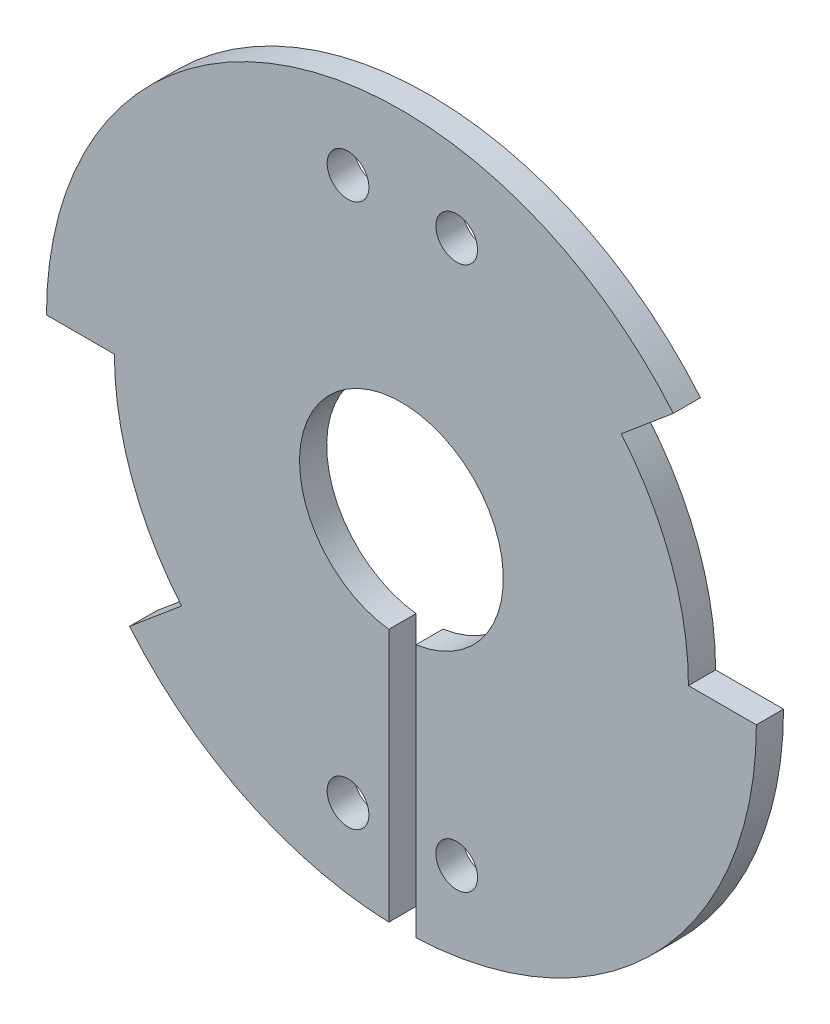
ISO-10303-21;
HEADER;
FILE_DESCRIPTION(('STEP AP214'),'2;1');
FILE_NAME('part.step','',(''),(''),'','','');
FILE_SCHEMA(('AUTOMOTIVE_DESIGN { 1 0 10303 214 1 1 1 1 }'));
ENDSEC;
DATA;
#1=APPLICATION_CONTEXT('core data for automotive mechanical design processes');
#2=APPLICATION_PROTOCOL_DEFINITION('international standard','automotive_design',2000,#1);
#3=PRODUCT_CONTEXT('',#1,'mechanical');
#4=PRODUCT('Part','Part','',(#3));
#5=PRODUCT_RELATED_PRODUCT_CATEGORY('part','',(#4));
#6=PRODUCT_DEFINITION_FORMATION('','',#4);
#7=PRODUCT_DEFINITION_CONTEXT('part definition',#1,'design');
#8=PRODUCT_DEFINITION('design','',#6,#7);
#9=PRODUCT_DEFINITION_SHAPE('','',#8);
#10=(LENGTH_UNIT() NAMED_UNIT(*) SI_UNIT(.MILLI.,.METRE.));
#11=(NAMED_UNIT(*) PLANE_ANGLE_UNIT() SI_UNIT($,.RADIAN.));
#12=(NAMED_UNIT(*) SI_UNIT($,.STERADIAN.) SOLID_ANGLE_UNIT());
#13=UNCERTAINTY_MEASURE_WITH_UNIT(LENGTH_MEASURE(1.E-05),#10,'distance_accuracy_value','');
#14=(GEOMETRIC_REPRESENTATION_CONTEXT(3) GLOBAL_UNCERTAINTY_ASSIGNED_CONTEXT((#13)) GLOBAL_UNIT_ASSIGNED_CONTEXT((#10,
#11,#12)) REPRESENTATION_CONTEXT('',''));
#15=CARTESIAN_POINT('',(0.,0.,0.));
#16=DIRECTION('',(0.,0.,1.));
#17=DIRECTION('',(1.,0.,0.));
#18=AXIS2_PLACEMENT_3D('',#15,#16,#17);
#19=CARTESIAN_POINT('',(0.,0.,5.08));
#20=DIRECTION('',(0.,0.,-1.));
#21=DIRECTION('',(-1.,0.,0.));
#22=AXIS2_PLACEMENT_3D('',#19,#20,#21);
#23=CYLINDRICAL_SURFACE('',#22,66.3575);
#24=DIRECTION('',(0.,0.,-1.));
#25=VECTOR('',#24,1.);
#26=CARTESIAN_POINT('',(2.71807751956726,-66.3018088806604,5.08));
#27=LINE('',#26,#25);
#28=CARTESIAN_POINT('',(2.71807751956726,-66.3018088806604,5.08));
#29=VERTEX_POINT('',#28);
#30=CARTESIAN_POINT('',(2.71807751956726,-66.3018088806604,0.));
#31=VERTEX_POINT('',#30);
#32=EDGE_CURVE('E227',#29,#31,#27,.T.);
#33=ORIENTED_EDGE('',*,*,#32,.T.);
#34=CARTESIAN_POINT('',(0.,0.,0.));
#35=DIRECTION('',(0.,0.,1.));
#36=DIRECTION('',(1.,0.,0.));
#37=AXIS2_PLACEMENT_3D('',#34,#35,#36);
#38=CIRCLE('',#37,66.3575);
#39=CARTESIAN_POINT('',(66.3575,0.,0.));
#40=VERTEX_POINT('',#39);
#41=EDGE_CURVE('E138',#31,#40,#38,.T.);
#42=ORIENTED_EDGE('',*,*,#41,.T.);
#43=DIRECTION('',(0.,0.,-1.));
#44=VECTOR('',#43,1.);
#45=CARTESIAN_POINT('',(66.3575,0.,5.081));
#46=LINE('',#45,#44);
#47=CARTESIAN_POINT('',(66.3575,0.,5.08));
#48=VERTEX_POINT('',#47);
#49=EDGE_CURVE('E188',#48,#40,#46,.T.);
#50=ORIENTED_EDGE('',*,*,#49,.F.);
#51=CARTESIAN_POINT('',(0.,0.,5.08));
#52=DIRECTION('',(0.,0.,1.));
#53=DIRECTION('',(1.,0.,0.));
#54=AXIS2_PLACEMENT_3D('',#51,#52,#53);
#55=CIRCLE('',#54,66.3575);
#56=EDGE_CURVE('E41',#29,#48,#55,.T.);
#57=ORIENTED_EDGE('',*,*,#56,.F.);
#58=EDGE_LOOP('',(#33,#42,#50,#57));
#59=FACE_BOUND('',#58,.T.);
#60=ADVANCED_FACE('F32',(#59),#23,.T.);
#61=CARTESIAN_POINT('',(0.,0.,5.08));
#62=DIRECTION('',(0.,0.,1.));
#63=DIRECTION('',(1.,0.,0.));
#64=AXIS2_PLACEMENT_3D('',#61,#62,#63);
#65=PLANE('',#64);
#66=CARTESIAN_POINT('',(-9.98192248043274,50.8,5.08));
#67=DIRECTION('',(0.,0.,1.));
#68=DIRECTION('',(1.,0.,0.));
#69=AXIS2_PLACEMENT_3D('',#66,#67,#68);
#70=CIRCLE('',#69,3.90061697542542);
#71=CARTESIAN_POINT('',(-6.08130550500732,50.8,5.08));
#72=VERTEX_POINT('',#71);
#73=EDGE_CURVE('E217',#72,#72,#70,.F.);
#74=ORIENTED_EDGE('',*,*,#73,.T.);
#75=EDGE_LOOP('',(#74));
#76=FACE_BOUND('',#75,.T.);
#77=CARTESIAN_POINT('',(10.3380775195672,50.8,5.08));
#78=DIRECTION('',(0.,0.,1.));
#79=DIRECTION('',(1.,0.,0.));
#80=AXIS2_PLACEMENT_3D('',#77,#78,#79);
#81=CIRCLE('',#80,3.90061697542542);
#82=CARTESIAN_POINT('',(14.2386944949927,50.8,5.08));
#83=VERTEX_POINT('',#82);
#84=EDGE_CURVE('E213',#83,#83,#81,.F.);
#85=ORIENTED_EDGE('',*,*,#84,.T.);
#86=EDGE_LOOP('',(#85));
#87=FACE_BOUND('',#86,.T.);
#88=CARTESIAN_POINT('',(-9.98192248043274,-50.8,5.08));
#89=DIRECTION('',(0.,0.,1.));
#90=DIRECTION('',(1.,0.,0.));
#91=AXIS2_PLACEMENT_3D('',#88,#89,#90);
#92=CIRCLE('',#91,3.90061697542542);
#93=CARTESIAN_POINT('',(-6.08130550500732,-50.8,5.08));
#94=VERTEX_POINT('',#93);
#95=EDGE_CURVE('E210',#94,#94,#92,.T.);
#96=ORIENTED_EDGE('',*,*,#95,.F.);
#97=EDGE_LOOP('',(#96));
#98=FACE_BOUND('',#97,.T.);
#99=CARTESIAN_POINT('',(10.3380775195673,-50.8,5.08));
#100=DIRECTION('',(0.,0.,1.));
#101=DIRECTION('',(1.,0.,0.));
#102=AXIS2_PLACEMENT_3D('',#99,#100,#101);
#103=CIRCLE('',#102,3.90061697542542);
#104=CARTESIAN_POINT('',(14.2386944949927,-50.8,5.08));
#105=VERTEX_POINT('',#104);
#106=EDGE_CURVE('E204',#105,#105,#103,.T.);
#107=ORIENTED_EDGE('',*,*,#106,.F.);
#108=EDGE_LOOP('',(#107));
#109=FACE_BOUND('',#108,.T.);
#110=CARTESIAN_POINT('',(0.,0.,5.08));
#111=DIRECTION('',(0.,0.,1.));
#112=DIRECTION('',(1.,0.,0.));
#113=AXIS2_PLACEMENT_3D('',#110,#111,#112);
#114=CIRCLE('',#113,19.05);
#115=CARTESIAN_POINT('',(2.71807751956726,-18.8550935982196,5.08));
#116=VERTEX_POINT('',#115);
#117=CARTESIAN_POINT('',(-2.36192248043274,-18.9030109293844,5.08));
#118=VERTEX_POINT('',#117);
#119=EDGE_CURVE('E142',#116,#118,#114,.T.);
#120=ORIENTED_EDGE('',*,*,#119,.F.);
#121=DIRECTION('',(0.,1.,0.));
#122=VECTOR('',#121,1.);
#123=CARTESIAN_POINT('',(2.71807751956726,-67.8586482101142,5.08));
#124=LINE('',#123,#122);
#125=EDGE_CURVE('E57',#29,#116,#124,.T.);
#126=ORIENTED_EDGE('',*,*,#125,.F.);
#127=ORIENTED_EDGE('',*,*,#56,.T.);
#128=DIRECTION('',(1.,0.,0.));
#129=VECTOR('',#128,1.);
#130=CARTESIAN_POINT('',(0.,-1.94868254120031E-12,5.08));
#131=LINE('',#130,#129);
#132=CARTESIAN_POINT('',(53.6575,-3.72953596401974E-13,5.08));
#133=VERTEX_POINT('',#132);
#134=EDGE_CURVE('E198',#133,#48,#131,.T.);
#135=ORIENTED_EDGE('',*,*,#134,.F.);
#136=CARTESIAN_POINT('',(0.,0.,5.08));
#137=DIRECTION('',(0.,0.,1.));
#138=DIRECTION('',(1.,0.,0.));
#139=AXIS2_PLACEMENT_3D('',#136,#137,#138);
#140=CIRCLE('',#139,53.6575);
#141=CARTESIAN_POINT('',(41.1040297066567,34.4903761667553,5.08));
#142=VERTEX_POINT('',#141);
#143=EDGE_CURVE('E175',#142,#133,#140,.F.);
#144=ORIENTED_EDGE('',*,*,#143,.F.);
#145=DIRECTION('',(0.766044443118981,0.642787609686536,0.));
#146=VECTOR('',#145,1.);
#147=CARTESIAN_POINT('',(0.,0.,5.08));
#148=LINE('',#147,#146);
#149=CARTESIAN_POINT('',(50.8327941342678,42.6537788097743,5.08));
#150=VERTEX_POINT('',#149);
#151=EDGE_CURVE('E178',#142,#150,#148,.T.);
#152=ORIENTED_EDGE('',*,*,#151,.T.);
#153=CARTESIAN_POINT('',(-66.3575,0.,5.08));
#154=VERTEX_POINT('',#153);
#155=EDGE_CURVE('E42',#150,#154,#55,.T.);
#156=ORIENTED_EDGE('',*,*,#155,.T.);
#157=DIRECTION('',(-1.,0.,0.));
#158=VECTOR('',#157,1.);
#159=CARTESIAN_POINT('',(0.,0.,5.08));
#160=LINE('',#159,#158);
#161=CARTESIAN_POINT('',(-53.6575,0.,5.08));
#162=VERTEX_POINT('',#161);
#163=EDGE_CURVE('E169',#162,#154,#160,.T.);
#164=ORIENTED_EDGE('',*,*,#163,.F.);
#165=CARTESIAN_POINT('',(0.,0.,5.08));
#166=DIRECTION('',(0.,0.,1.));
#167=DIRECTION('',(1.,0.,0.));
#168=AXIS2_PLACEMENT_3D('',#165,#166,#167);
#169=CIRCLE('',#168,53.6575);
#170=CARTESIAN_POINT('',(-41.1040297066565,-34.4903761667556,5.08));
#171=VERTEX_POINT('',#170);
#172=EDGE_CURVE('E143',#171,#162,#169,.F.);
#173=ORIENTED_EDGE('',*,*,#172,.F.);
#174=DIRECTION('',(-0.766044443119,-0.642787609686513,0.));
#175=VECTOR('',#174,1.);
#176=CARTESIAN_POINT('',(1.26670674748648E-12,-1.50960231708044E-12,5.08));
#177=LINE('',#176,#175);
#178=CARTESIAN_POINT('',(-50.8327941342678,-42.6537788097743,5.08));
#179=VERTEX_POINT('',#178);
#180=EDGE_CURVE('E172',#171,#179,#177,.T.);
#181=ORIENTED_EDGE('',*,*,#180,.T.);
#182=CARTESIAN_POINT('',(-2.36192248043274,-66.3154516568079,5.08));
#183=VERTEX_POINT('',#182);
#184=EDGE_CURVE('E11',#179,#183,#55,.T.);
#185=ORIENTED_EDGE('',*,*,#184,.T.);
#186=DIRECTION('',(0.,1.,0.));
#187=VECTOR('',#186,1.);
#188=CARTESIAN_POINT('',(-2.36192248043274,-67.8586482101142,5.08));
#189=LINE('',#188,#187);
#190=EDGE_CURVE('E139',#183,#118,#189,.T.);
#191=ORIENTED_EDGE('',*,*,#190,.T.);
#192=EDGE_LOOP('',(#120,#126,#127,#135,#144,#152,#156,#164,#173,#181,#185,#191));
#193=FACE_BOUND('',#192,.T.);
#194=ADVANCED_FACE('F233',(#76,#87,#98,#109,#193),#65,.T.);
#195=CARTESIAN_POINT('',(0.,0.,0.));
#196=DIRECTION('',(0.,0.,1.));
#197=DIRECTION('',(1.,0.,0.));
#198=AXIS2_PLACEMENT_3D('',#195,#196,#197);
#199=PLANE('',#198);
#200=CARTESIAN_POINT('',(10.3380775195673,-50.8,0.));
#201=DIRECTION('',(0.,0.,1.));
#202=DIRECTION('',(1.,0.,0.));
#203=AXIS2_PLACEMENT_3D('',#200,#201,#202);
#204=CIRCLE('',#203,3.90061697542542);
#205=CARTESIAN_POINT('',(14.2386944949927,-50.8,0.));
#206=VERTEX_POINT('',#205);
#207=EDGE_CURVE('E201',#206,#206,#204,.T.);
#208=ORIENTED_EDGE('',*,*,#207,.T.);
#209=EDGE_LOOP('',(#208));
#210=FACE_BOUND('',#209,.T.);
#211=CARTESIAN_POINT('',(-9.98192248043274,-50.8,0.));
#212=DIRECTION('',(0.,0.,1.));
#213=DIRECTION('',(1.,0.,0.));
#214=AXIS2_PLACEMENT_3D('',#211,#212,#213);
#215=CIRCLE('',#214,3.90061697542542);
#216=CARTESIAN_POINT('',(-6.08130550500732,-50.8,0.));
#217=VERTEX_POINT('',#216);
#218=EDGE_CURVE('E207',#217,#217,#215,.T.);
#219=ORIENTED_EDGE('',*,*,#218,.T.);
#220=EDGE_LOOP('',(#219));
#221=FACE_BOUND('',#220,.T.);
#222=CARTESIAN_POINT('',(10.3380775195672,50.8,0.));
#223=DIRECTION('',(0.,0.,-1.));
#224=DIRECTION('',(-1.,0.,0.));
#225=AXIS2_PLACEMENT_3D('',#222,#223,#224);
#226=CIRCLE('',#225,3.90061697542542);
#227=CARTESIAN_POINT('',(6.43746054414183,50.8,0.));
#228=VERTEX_POINT('',#227);
#229=EDGE_CURVE('E214',#228,#228,#226,.T.);
#230=ORIENTED_EDGE('',*,*,#229,.F.);
#231=EDGE_LOOP('',(#230));
#232=FACE_BOUND('',#231,.T.);
#233=CARTESIAN_POINT('',(-9.98192248043274,50.8,0.));
#234=DIRECTION('',(0.,0.,-1.));
#235=DIRECTION('',(-1.,0.,0.));
#236=AXIS2_PLACEMENT_3D('',#233,#234,#235);
#237=CIRCLE('',#236,3.90061697542542);
#238=CARTESIAN_POINT('',(-13.8825394558582,50.8,0.));
#239=VERTEX_POINT('',#238);
#240=EDGE_CURVE('E220',#239,#239,#237,.T.);
#241=ORIENTED_EDGE('',*,*,#240,.F.);
#242=EDGE_LOOP('',(#241));
#243=FACE_BOUND('',#242,.T.);
#244=DIRECTION('',(0.,1.,0.));
#245=VECTOR('',#244,1.);
#246=CARTESIAN_POINT('',(2.71807751956726,-67.8586482101142,0.));
#247=LINE('',#246,#245);
#248=CARTESIAN_POINT('',(2.71807751956726,-18.8550935982196,0.));
#249=VERTEX_POINT('',#248);
#250=EDGE_CURVE('E123',#31,#249,#247,.T.);
#251=ORIENTED_EDGE('',*,*,#250,.T.);
#252=CARTESIAN_POINT('',(0.,0.,0.));
#253=DIRECTION('',(0.,0.,1.));
#254=DIRECTION('',(1.,0.,0.));
#255=AXIS2_PLACEMENT_3D('',#252,#253,#254);
#256=CIRCLE('',#255,19.05);
#257=CARTESIAN_POINT('',(-2.36192248043274,-18.9030109293844,0.));
#258=VERTEX_POINT('',#257);
#259=EDGE_CURVE('E136',#249,#258,#256,.T.);
#260=ORIENTED_EDGE('',*,*,#259,.T.);
#261=DIRECTION('',(0.,1.,0.));
#262=VECTOR('',#261,1.);
#263=CARTESIAN_POINT('',(-2.36192248043274,-67.8586482101142,0.));
#264=LINE('',#263,#262);
#265=CARTESIAN_POINT('',(-2.36192248043274,-66.3154516568079,0.));
#266=VERTEX_POINT('',#265);
#267=EDGE_CURVE('E49',#266,#258,#264,.T.);
#268=ORIENTED_EDGE('',*,*,#267,.F.);
#269=CARTESIAN_POINT('',(-50.8327941342678,-42.6537788097743,0.));
#270=VERTEX_POINT('',#269);
#271=EDGE_CURVE('E36',#270,#266,#38,.T.);
#272=ORIENTED_EDGE('',*,*,#271,.F.);
#273=DIRECTION('',(-0.766044443119,-0.642787609686513,0.));
#274=VECTOR('',#273,1.);
#275=CARTESIAN_POINT('',(1.26670674748648E-12,-1.50960231708044E-12,0.));
#276=LINE('',#275,#274);
#277=CARTESIAN_POINT('',(-41.1040297066565,-34.4903761667556,0.));
#278=VERTEX_POINT('',#277);
#279=EDGE_CURVE('E164',#278,#270,#276,.T.);
#280=ORIENTED_EDGE('',*,*,#279,.F.);
#281=CARTESIAN_POINT('',(0.,0.,0.));
#282=DIRECTION('',(0.,0.,1.));
#283=DIRECTION('',(1.,0.,0.));
#284=AXIS2_PLACEMENT_3D('',#281,#282,#283);
#285=CIRCLE('',#284,53.6575);
#286=CARTESIAN_POINT('',(-53.6575,0.,0.));
#287=VERTEX_POINT('',#286);
#288=EDGE_CURVE('E161',#278,#287,#285,.F.);
#289=ORIENTED_EDGE('',*,*,#288,.T.);
#290=DIRECTION('',(-1.,0.,0.));
#291=VECTOR('',#290,1.);
#292=CARTESIAN_POINT('',(0.,0.,0.));
#293=LINE('',#292,#291);
#294=CARTESIAN_POINT('',(-66.3575,0.,0.));
#295=VERTEX_POINT('',#294);
#296=EDGE_CURVE('E166',#287,#295,#293,.T.);
#297=ORIENTED_EDGE('',*,*,#296,.T.);
#298=CARTESIAN_POINT('',(50.8327941342678,42.6537788097743,0.));
#299=VERTEX_POINT('',#298);
#300=EDGE_CURVE('E145',#299,#295,#38,.T.);
#301=ORIENTED_EDGE('',*,*,#300,.F.);
#302=DIRECTION('',(0.766044443118981,0.642787609686536,0.));
#303=VECTOR('',#302,1.);
#304=CARTESIAN_POINT('',(0.,0.,0.));
#305=LINE('',#304,#303);
#306=CARTESIAN_POINT('',(41.1040297066567,34.4903761667553,0.));
#307=VERTEX_POINT('',#306);
#308=EDGE_CURVE('E181',#307,#299,#305,.T.);
#309=ORIENTED_EDGE('',*,*,#308,.F.);
#310=CARTESIAN_POINT('',(0.,0.,0.));
#311=DIRECTION('',(0.,0.,1.));
#312=DIRECTION('',(1.,0.,0.));
#313=AXIS2_PLACEMENT_3D('',#310,#311,#312);
#314=CIRCLE('',#313,53.6575);
#315=CARTESIAN_POINT('',(53.6575,-3.72953596401974E-13,0.));
#316=VERTEX_POINT('',#315);
#317=EDGE_CURVE('E183',#307,#316,#314,.F.);
#318=ORIENTED_EDGE('',*,*,#317,.T.);
#319=DIRECTION('',(1.,0.,0.));
#320=VECTOR('',#319,1.);
#321=CARTESIAN_POINT('',(0.,-1.94868254120031E-12,0.));
#322=LINE('',#321,#320);
#323=EDGE_CURVE('E186',#316,#40,#322,.T.);
#324=ORIENTED_EDGE('',*,*,#323,.T.);
#325=ORIENTED_EDGE('',*,*,#41,.F.);
#326=EDGE_LOOP('',(#251,#260,#268,#272,#280,#289,#297,#301,#309,#318,#324,#325));
#327=FACE_BOUND('',#326,.T.);
#328=ADVANCED_FACE('F135',(#210,#221,#232,#243,#327),#199,.F.);
#329=CARTESIAN_POINT('',(0.,0.,5.081));
#330=DIRECTION('',(0.,0.,-1.));
#331=DIRECTION('',(-1.,0.,0.));
#332=AXIS2_PLACEMENT_3D('',#329,#330,#331);
#333=CYLINDRICAL_SURFACE('',#332,19.05);
#334=ORIENTED_EDGE('',*,*,#259,.F.);
#335=DIRECTION('',(0.,0.,-1.));
#336=VECTOR('',#335,1.);
#337=CARTESIAN_POINT('',(2.71807751956726,-18.8550935982196,5.081));
#338=LINE('',#337,#336);
#339=EDGE_CURVE('E120',#116,#249,#338,.T.);
#340=ORIENTED_EDGE('',*,*,#339,.F.);
#341=ORIENTED_EDGE('',*,*,#119,.T.);
#342=DIRECTION('',(0.,0.,-1.));
#343=VECTOR('',#342,1.);
#344=CARTESIAN_POINT('',(-2.36192248043274,-18.9030109293844,5.081));
#345=LINE('',#344,#343);
#346=EDGE_CURVE('E129',#118,#258,#345,.T.);
#347=ORIENTED_EDGE('',*,*,#346,.T.);
#348=EDGE_LOOP('',(#334,#340,#341,#347));
#349=FACE_BOUND('',#348,.T.);
#350=ADVANCED_FACE('F141',(#349),#333,.F.);
#351=ORIENTED_EDGE('',*,*,#271,.T.);
#352=DIRECTION('',(0.,0.,-1.));
#353=VECTOR('',#352,1.);
#354=CARTESIAN_POINT('',(-2.36192248043274,-66.3154516568079,5.08));
#355=LINE('',#354,#353);
#356=EDGE_CURVE('E130',#183,#266,#355,.T.);
#357=ORIENTED_EDGE('',*,*,#356,.F.);
#358=ORIENTED_EDGE('',*,*,#184,.F.);
#359=DIRECTION('',(0.,0.,-1.));
#360=VECTOR('',#359,1.);
#361=CARTESIAN_POINT('',(-50.8327941342678,-42.6537788097743,5.081));
#362=LINE('',#361,#360);
#363=EDGE_CURVE('E153',#179,#270,#362,.T.);
#364=ORIENTED_EDGE('',*,*,#363,.T.);
#365=EDGE_LOOP('',(#351,#357,#358,#364));
#366=FACE_BOUND('',#365,.T.);
#367=ADVANCED_FACE('F239',(#366),#23,.T.);
#368=ORIENTED_EDGE('',*,*,#155,.F.);
#369=DIRECTION('',(0.,0.,-1.));
#370=VECTOR('',#369,1.);
#371=CARTESIAN_POINT('',(50.8327941342678,42.6537788097743,5.081));
#372=LINE('',#371,#370);
#373=EDGE_CURVE('E195',#150,#299,#372,.T.);
#374=ORIENTED_EDGE('',*,*,#373,.T.);
#375=ORIENTED_EDGE('',*,*,#300,.T.);
#376=DIRECTION('',(0.,0.,-1.));
#377=VECTOR('',#376,1.);
#378=CARTESIAN_POINT('',(-66.3575,0.,5.081));
#379=LINE('',#378,#377);
#380=EDGE_CURVE('E148',#154,#295,#379,.T.);
#381=ORIENTED_EDGE('',*,*,#380,.F.);
#382=EDGE_LOOP('',(#368,#374,#375,#381));
#383=FACE_BOUND('',#382,.T.);
#384=ADVANCED_FACE('F34',(#383),#23,.T.);
#385=CARTESIAN_POINT('',(0.,0.,5.081));
#386=DIRECTION('',(0.,-1.,0.));
#387=DIRECTION('',(1.,0.,0.));
#388=AXIS2_PLACEMENT_3D('',#385,#386,#387);
#389=PLANE('',#388);
#390=ORIENTED_EDGE('',*,*,#163,.T.);
#391=ORIENTED_EDGE('',*,*,#380,.T.);
#392=ORIENTED_EDGE('',*,*,#296,.F.);
#393=DIRECTION('',(0.,0.,-1.));
#394=VECTOR('',#393,1.);
#395=CARTESIAN_POINT('',(-53.6575,0.,5.081));
#396=LINE('',#395,#394);
#397=EDGE_CURVE('E158',#162,#287,#396,.T.);
#398=ORIENTED_EDGE('',*,*,#397,.F.);
#399=EDGE_LOOP('',(#390,#391,#392,#398));
#400=FACE_BOUND('',#399,.T.);
#401=ADVANCED_FACE('F248',(#400),#389,.T.);
#402=CARTESIAN_POINT('',(1.26670674748648E-12,-1.50960231708044E-12,5.081));
#403=DIRECTION('',(0.642787609686513,-0.766044443119,0.));
#404=DIRECTION('',(0.766044443119,0.642787609686513,0.));
#405=AXIS2_PLACEMENT_3D('',#402,#403,#404);
#406=PLANE('',#405);
#407=DIRECTION('',(0.,0.,-1.));
#408=VECTOR('',#407,1.);
#409=CARTESIAN_POINT('',(-41.1040297066565,-34.4903761667556,5.081));
#410=LINE('',#409,#408);
#411=EDGE_CURVE('E156',#171,#278,#410,.T.);
#412=ORIENTED_EDGE('',*,*,#411,.T.);
#413=ORIENTED_EDGE('',*,*,#279,.T.);
#414=ORIENTED_EDGE('',*,*,#363,.F.);
#415=ORIENTED_EDGE('',*,*,#180,.F.);
#416=EDGE_LOOP('',(#412,#413,#414,#415));
#417=FACE_BOUND('',#416,.T.);
#418=ADVANCED_FACE('F280',(#417),#406,.F.);
#419=CARTESIAN_POINT('',(0.,0.,5.081));
#420=DIRECTION('',(0.,0.,-1.));
#421=DIRECTION('',(-1.,0.,0.));
#422=AXIS2_PLACEMENT_3D('',#419,#420,#421);
#423=CYLINDRICAL_SURFACE('',#422,53.6575);
#424=ORIENTED_EDGE('',*,*,#172,.T.);
#425=ORIENTED_EDGE('',*,*,#397,.T.);
#426=ORIENTED_EDGE('',*,*,#288,.F.);
#427=ORIENTED_EDGE('',*,*,#411,.F.);
#428=EDGE_LOOP('',(#424,#425,#426,#427));
#429=FACE_BOUND('',#428,.T.);
#430=ADVANCED_FACE('F252',(#429),#423,.T.);
#431=CARTESIAN_POINT('',(0.,0.,5.081));
#432=DIRECTION('',(-0.642787609686536,0.766044443118981,0.));
#433=DIRECTION('',(-0.766044443118981,-0.642787609686536,0.));
#434=AXIS2_PLACEMENT_3D('',#431,#432,#433);
#435=PLANE('',#434);
#436=DIRECTION('',(0.,0.,-1.));
#437=VECTOR('',#436,1.);
#438=CARTESIAN_POINT('',(41.1040297066567,34.4903761667553,5.081));
#439=LINE('',#438,#437);
#440=EDGE_CURVE('E193',#142,#307,#439,.T.);
#441=ORIENTED_EDGE('',*,*,#440,.T.);
#442=ORIENTED_EDGE('',*,*,#308,.T.);
#443=ORIENTED_EDGE('',*,*,#373,.F.);
#444=ORIENTED_EDGE('',*,*,#151,.F.);
#445=EDGE_LOOP('',(#441,#442,#443,#444));
#446=FACE_BOUND('',#445,.T.);
#447=ADVANCED_FACE('F259',(#446),#435,.F.);
#448=CARTESIAN_POINT('',(0.,0.,5.081));
#449=DIRECTION('',(0.,0.,-1.));
#450=DIRECTION('',(-1.,0.,0.));
#451=AXIS2_PLACEMENT_3D('',#448,#449,#450);
#452=CYLINDRICAL_SURFACE('',#451,53.6575);
#453=ORIENTED_EDGE('',*,*,#143,.T.);
#454=DIRECTION('',(0.,0.,-1.));
#455=VECTOR('',#454,1.);
#456=CARTESIAN_POINT('',(53.6575,-3.72953596401974E-13,5.081));
#457=LINE('',#456,#455);
#458=EDGE_CURVE('E191',#133,#316,#457,.T.);
#459=ORIENTED_EDGE('',*,*,#458,.T.);
#460=ORIENTED_EDGE('',*,*,#317,.F.);
#461=ORIENTED_EDGE('',*,*,#440,.F.);
#462=EDGE_LOOP('',(#453,#459,#460,#461));
#463=FACE_BOUND('',#462,.T.);
#464=ADVANCED_FACE('F263',(#463),#452,.T.);
#465=CARTESIAN_POINT('',(0.,-1.94868254120031E-12,5.081));
#466=DIRECTION('',(0.,1.,0.));
#467=DIRECTION('',(-1.,0.,0.));
#468=AXIS2_PLACEMENT_3D('',#465,#466,#467);
#469=PLANE('',#468);
#470=ORIENTED_EDGE('',*,*,#134,.T.);
#471=ORIENTED_EDGE('',*,*,#49,.T.);
#472=ORIENTED_EDGE('',*,*,#323,.F.);
#473=ORIENTED_EDGE('',*,*,#458,.F.);
#474=EDGE_LOOP('',(#470,#471,#472,#473));
#475=FACE_BOUND('',#474,.T.);
#476=ADVANCED_FACE('F265',(#475),#469,.T.);
#477=CARTESIAN_POINT('',(10.3380775195673,-50.8,5.081));
#478=DIRECTION('',(0.,0.,-1.));
#479=DIRECTION('',(-1.,0.,0.));
#480=AXIS2_PLACEMENT_3D('',#477,#478,#479);
#481=CYLINDRICAL_SURFACE('',#480,3.90061697542542);
#482=ORIENTED_EDGE('',*,*,#106,.T.);
#483=EDGE_LOOP('',(#482));
#484=FACE_BOUND('',#483,.T.);
#485=ORIENTED_EDGE('',*,*,#207,.F.);
#486=EDGE_LOOP('',(#485));
#487=FACE_BOUND('',#486,.T.);
#488=ADVANCED_FACE('F320',(#484,#487),#481,.F.);
#489=CARTESIAN_POINT('',(-9.98192248043274,-50.8,5.081));
#490=DIRECTION('',(0.,0.,-1.));
#491=DIRECTION('',(-1.,0.,0.));
#492=AXIS2_PLACEMENT_3D('',#489,#490,#491);
#493=CYLINDRICAL_SURFACE('',#492,3.90061697542542);
#494=ORIENTED_EDGE('',*,*,#95,.T.);
#495=EDGE_LOOP('',(#494));
#496=FACE_BOUND('',#495,.T.);
#497=ORIENTED_EDGE('',*,*,#218,.F.);
#498=EDGE_LOOP('',(#497));
#499=FACE_BOUND('',#498,.T.);
#500=ADVANCED_FACE('F312',(#496,#499),#493,.F.);
#501=CARTESIAN_POINT('',(10.3380775195672,50.8,5.081));
#502=DIRECTION('',(0.,0.,-1.));
#503=DIRECTION('',(-1.,0.,0.));
#504=AXIS2_PLACEMENT_3D('',#501,#502,#503);
#505=CYLINDRICAL_SURFACE('',#504,3.90061697542542);
#506=ORIENTED_EDGE('',*,*,#84,.F.);
#507=EDGE_LOOP('',(#506));
#508=FACE_BOUND('',#507,.T.);
#509=ORIENTED_EDGE('',*,*,#229,.T.);
#510=EDGE_LOOP('',(#509));
#511=FACE_BOUND('',#510,.T.);
#512=ADVANCED_FACE('F304',(#508,#511),#505,.F.);
#513=CARTESIAN_POINT('',(-9.98192248043274,50.8,5.081));
#514=DIRECTION('',(0.,0.,-1.));
#515=DIRECTION('',(-1.,0.,0.));
#516=AXIS2_PLACEMENT_3D('',#513,#514,#515);
#517=CYLINDRICAL_SURFACE('',#516,3.90061697542542);
#518=ORIENTED_EDGE('',*,*,#73,.F.);
#519=EDGE_LOOP('',(#518));
#520=FACE_BOUND('',#519,.T.);
#521=ORIENTED_EDGE('',*,*,#240,.T.);
#522=EDGE_LOOP('',(#521));
#523=FACE_BOUND('',#522,.T.);
#524=ADVANCED_FACE('F302',(#520,#523),#517,.F.);
#525=CARTESIAN_POINT('',(-2.36192248043274,-67.8586482101142,5.081));
#526=DIRECTION('',(-1.,0.,0.));
#527=DIRECTION('',(0.,0.,1.));
#528=AXIS2_PLACEMENT_3D('',#525,#526,#527);
#529=PLANE('',#528);
#530=ORIENTED_EDGE('',*,*,#356,.T.);
#531=ORIENTED_EDGE('',*,*,#267,.T.);
#532=ORIENTED_EDGE('',*,*,#346,.F.);
#533=ORIENTED_EDGE('',*,*,#190,.F.);
#534=EDGE_LOOP('',(#530,#531,#532,#533));
#535=FACE_BOUND('',#534,.T.);
#536=ADVANCED_FACE('F236',(#535),#529,.F.);
#537=CARTESIAN_POINT('',(2.71807751956726,-67.8586482101142,5.081));
#538=DIRECTION('',(-1.,0.,0.));
#539=DIRECTION('',(0.,0.,1.));
#540=AXIS2_PLACEMENT_3D('',#537,#538,#539);
#541=PLANE('',#540);
#542=ORIENTED_EDGE('',*,*,#125,.T.);
#543=ORIENTED_EDGE('',*,*,#339,.T.);
#544=ORIENTED_EDGE('',*,*,#250,.F.);
#545=ORIENTED_EDGE('',*,*,#32,.F.);
#546=EDGE_LOOP('',(#542,#543,#544,#545));
#547=FACE_BOUND('',#546,.T.);
#548=ADVANCED_FACE('F122',(#547),#541,.T.);
#549=CLOSED_SHELL('',(#60,#194,#328,#350,#367,#384,#401,#418,#430,#447,#464,#476,#488,#500,#512,
#524,#536,#548));
#550=MANIFOLD_SOLID_BREP('B2',#549);
#551=ADVANCED_BREP_SHAPE_REPRESENTATION('',(#18,#550),#14);
#552=SHAPE_DEFINITION_REPRESENTATION(#9,#551);
ENDSEC;
END-ISO-10303-21;
